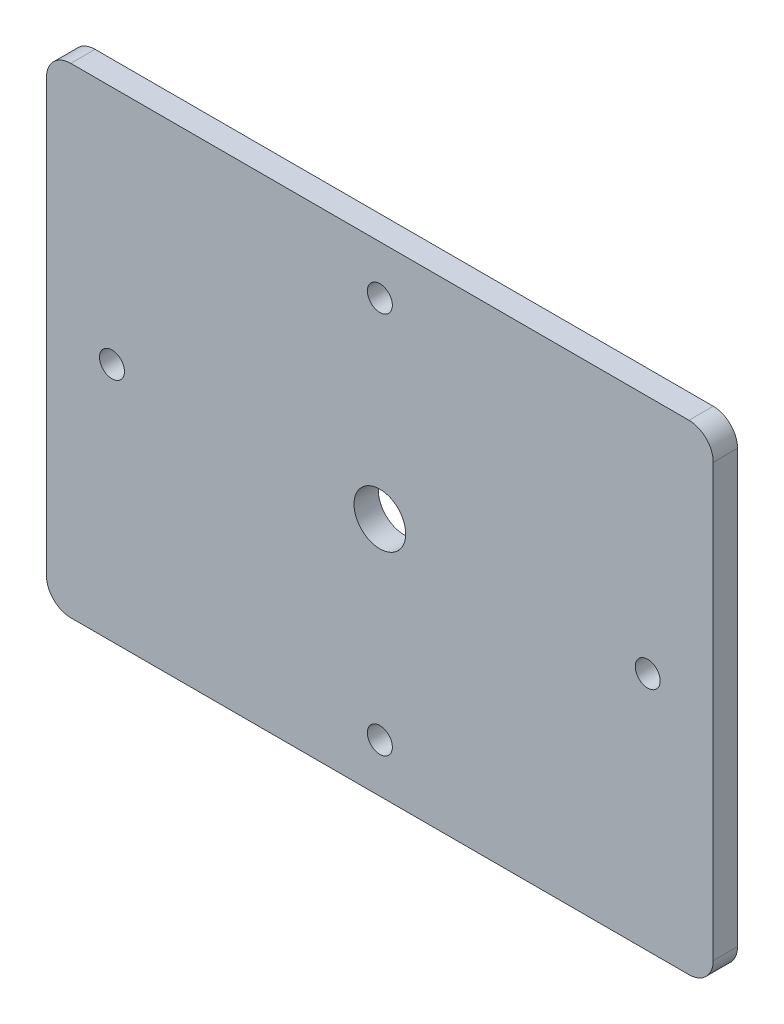
ISO-10303-21;
HEADER;
FILE_DESCRIPTION(('STEP AP214'),'2;1');
FILE_NAME('part.step','',(''),(''),'','','');
FILE_SCHEMA(('AUTOMOTIVE_DESIGN { 1 0 10303 214 1 1 1 1 }'));
ENDSEC;
DATA;
#1=APPLICATION_CONTEXT('core data for automotive mechanical design processes');
#2=APPLICATION_PROTOCOL_DEFINITION('international standard','automotive_design',2000,#1);
#3=PRODUCT_CONTEXT('',#1,'mechanical');
#4=PRODUCT('Part','Part','',(#3));
#5=PRODUCT_RELATED_PRODUCT_CATEGORY('part','',(#4));
#6=PRODUCT_DEFINITION_FORMATION('','',#4);
#7=PRODUCT_DEFINITION_CONTEXT('part definition',#1,'design');
#8=PRODUCT_DEFINITION('design','',#6,#7);
#9=PRODUCT_DEFINITION_SHAPE('','',#8);
#10=(LENGTH_UNIT() NAMED_UNIT(*) SI_UNIT(.MILLI.,.METRE.));
#11=(NAMED_UNIT(*) PLANE_ANGLE_UNIT() SI_UNIT($,.RADIAN.));
#12=(NAMED_UNIT(*) SI_UNIT($,.STERADIAN.) SOLID_ANGLE_UNIT());
#13=UNCERTAINTY_MEASURE_WITH_UNIT(LENGTH_MEASURE(1.E-05),#10,'distance_accuracy_value','');
#14=(GEOMETRIC_REPRESENTATION_CONTEXT(3) GLOBAL_UNCERTAINTY_ASSIGNED_CONTEXT((#13)) GLOBAL_UNIT_ASSIGNED_CONTEXT((#10,
#11,#12)) REPRESENTATION_CONTEXT('',''));
#15=CARTESIAN_POINT('',(0.,0.,0.));
#16=DIRECTION('',(0.,0.,1.));
#17=DIRECTION('',(1.,0.,0.));
#18=AXIS2_PLACEMENT_3D('',#15,#16,#17);
#19=CARTESIAN_POINT('',(0.,0.,0.));
#20=DIRECTION('',(0.,0.,-1.));
#21=DIRECTION('',(-1.,0.,0.));
#22=AXIS2_PLACEMENT_3D('',#19,#20,#21);
#23=PLANE('',#22);
#24=CARTESIAN_POINT('',(43.561,31.369,0.));
#25=DIRECTION('',(0.,0.,1.));
#26=DIRECTION('',(1.,0.,0.));
#27=AXIS2_PLACEMENT_3D('',#24,#25,#26);
#28=CIRCLE('',#27,3.3782);
#29=CARTESIAN_POINT('',(46.9392,31.369,0.));
#30=VERTEX_POINT('',#29);
#31=EDGE_CURVE('E225',#30,#30,#28,.T.);
#32=ORIENTED_EDGE('',*,*,#31,.T.);
#33=EDGE_LOOP('',(#32));
#34=FACE_BOUND('',#33,.T.);
#35=CARTESIAN_POINT('',(78.561,31.369,0.));
#36=DIRECTION('',(0.,0.,1.));
#37=DIRECTION('',(1.,0.,0.));
#38=AXIS2_PLACEMENT_3D('',#35,#36,#37);
#39=CIRCLE('',#38,1.63194999999999);
#40=CARTESIAN_POINT('',(80.19295,31.369,0.));
#41=VERTEX_POINT('',#40);
#42=EDGE_CURVE('E217',#41,#41,#39,.T.);
#43=ORIENTED_EDGE('',*,*,#42,.T.);
#44=EDGE_LOOP('',(#43));
#45=FACE_BOUND('',#44,.T.);
#46=DIRECTION('',(0.,-1.,0.));
#47=VECTOR('',#46,1.);
#48=CARTESIAN_POINT('',(0.,0.,0.));
#49=LINE('',#48,#47);
#50=CARTESIAN_POINT('',(0.,59.563,0.));
#51=VERTEX_POINT('',#50);
#52=CARTESIAN_POINT('',(0.,3.175,0.));
#53=VERTEX_POINT('',#52);
#54=EDGE_CURVE('E124',#51,#53,#49,.T.);
#55=ORIENTED_EDGE('',*,*,#54,.F.);
#56=CARTESIAN_POINT('',(3.175,59.563,0.));
#57=DIRECTION('',(0.,0.,-1.));
#58=DIRECTION('',(-1.,0.,0.));
#59=AXIS2_PLACEMENT_3D('',#56,#57,#58);
#60=CIRCLE('',#59,3.175);
#61=CARTESIAN_POINT('',(3.175,62.738,0.));
#62=VERTEX_POINT('',#61);
#63=EDGE_CURVE('E106',#51,#62,#60,.T.);
#64=ORIENTED_EDGE('',*,*,#63,.T.);
#65=DIRECTION('',(-1.,0.,0.));
#66=VECTOR('',#65,1.);
#67=CARTESIAN_POINT('',(0.,62.738,0.));
#68=LINE('',#67,#66);
#69=CARTESIAN_POINT('',(83.947,62.738,0.));
#70=VERTEX_POINT('',#69);
#71=EDGE_CURVE('E152',#70,#62,#68,.T.);
#72=ORIENTED_EDGE('',*,*,#71,.F.);
#73=CARTESIAN_POINT('',(83.947,59.563,0.));
#74=DIRECTION('',(0.,0.,-1.));
#75=DIRECTION('',(-1.,0.,0.));
#76=AXIS2_PLACEMENT_3D('',#73,#74,#75);
#77=CIRCLE('',#76,3.175);
#78=CARTESIAN_POINT('',(87.122,59.563,0.));
#79=VERTEX_POINT('',#78);
#80=EDGE_CURVE('E129',#70,#79,#77,.T.);
#81=ORIENTED_EDGE('',*,*,#80,.T.);
#82=DIRECTION('',(0.,1.,0.));
#83=VECTOR('',#82,1.);
#84=CARTESIAN_POINT('',(87.122,0.,0.));
#85=LINE('',#84,#83);
#86=CARTESIAN_POINT('',(87.122,3.175,0.));
#87=VERTEX_POINT('',#86);
#88=EDGE_CURVE('E141',#87,#79,#85,.T.);
#89=ORIENTED_EDGE('',*,*,#88,.F.);
#90=CARTESIAN_POINT('',(83.947,3.175,0.));
#91=DIRECTION('',(0.,0.,-1.));
#92=DIRECTION('',(-1.,0.,0.));
#93=AXIS2_PLACEMENT_3D('',#90,#91,#92);
#94=CIRCLE('',#93,3.175);
#95=CARTESIAN_POINT('',(83.947,0.,0.));
#96=VERTEX_POINT('',#95);
#97=EDGE_CURVE('E159',#87,#96,#94,.T.);
#98=ORIENTED_EDGE('',*,*,#97,.T.);
#99=DIRECTION('',(1.,0.,0.));
#100=VECTOR('',#99,1.);
#101=CARTESIAN_POINT('',(0.,0.,0.));
#102=LINE('',#101,#100);
#103=CARTESIAN_POINT('',(3.175,0.,0.));
#104=VERTEX_POINT('',#103);
#105=EDGE_CURVE('E135',#104,#96,#102,.T.);
#106=ORIENTED_EDGE('',*,*,#105,.F.);
#107=CARTESIAN_POINT('',(3.175,3.175,0.));
#108=DIRECTION('',(0.,0.,-1.));
#109=DIRECTION('',(-1.,0.,0.));
#110=AXIS2_PLACEMENT_3D('',#107,#108,#109);
#111=CIRCLE('',#110,3.175);
#112=EDGE_CURVE('E118',#104,#53,#111,.T.);
#113=ORIENTED_EDGE('',*,*,#112,.T.);
#114=EDGE_LOOP('',(#55,#64,#72,#81,#89,#98,#106,#113));
#115=FACE_BOUND('',#114,.T.);
#116=CARTESIAN_POINT('',(43.561,6.369,0.));
#117=DIRECTION('',(0.,0.,1.));
#118=DIRECTION('',(1.,0.,0.));
#119=AXIS2_PLACEMENT_3D('',#116,#117,#118);
#120=CIRCLE('',#119,1.63195);
#121=CARTESIAN_POINT('',(45.19295,6.369,0.));
#122=VERTEX_POINT('',#121);
#123=EDGE_CURVE('E136',#122,#122,#120,.T.);
#124=ORIENTED_EDGE('',*,*,#123,.T.);
#125=EDGE_LOOP('',(#124));
#126=FACE_BOUND('',#125,.T.);
#127=CARTESIAN_POINT('',(43.561,56.369,0.));
#128=DIRECTION('',(0.,0.,1.));
#129=DIRECTION('',(1.,0.,0.));
#130=AXIS2_PLACEMENT_3D('',#127,#128,#129);
#131=CIRCLE('',#130,1.63195);
#132=CARTESIAN_POINT('',(45.19295,56.369,0.));
#133=VERTEX_POINT('',#132);
#134=EDGE_CURVE('E201',#133,#133,#131,.T.);
#135=ORIENTED_EDGE('',*,*,#134,.T.);
#136=EDGE_LOOP('',(#135));
#137=FACE_BOUND('',#136,.T.);
#138=CARTESIAN_POINT('',(8.56100000000001,31.369,0.));
#139=DIRECTION('',(0.,0.,1.));
#140=DIRECTION('',(1.,0.,0.));
#141=AXIS2_PLACEMENT_3D('',#138,#139,#140);
#142=CIRCLE('',#141,1.63195);
#143=CARTESIAN_POINT('',(10.19295,31.369,0.));
#144=VERTEX_POINT('',#143);
#145=EDGE_CURVE('E209',#144,#144,#142,.T.);
#146=ORIENTED_EDGE('',*,*,#145,.T.);
#147=EDGE_LOOP('',(#146));
#148=FACE_BOUND('',#147,.T.);
#149=ADVANCED_FACE('F39',(#34,#45,#115,#126,#137,#148),#23,.T.);
#150=CARTESIAN_POINT('',(0.,0.,3.175));
#151=DIRECTION('',(1.,0.,0.));
#152=DIRECTION('',(0.,0.,-1.));
#153=AXIS2_PLACEMENT_3D('',#150,#151,#152);
#154=PLANE('',#153);
#155=DIRECTION('',(0.,-1.,0.));
#156=VECTOR('',#155,1.);
#157=CARTESIAN_POINT('',(0.,0.,3.175));
#158=LINE('',#157,#156);
#159=CARTESIAN_POINT('',(0.,59.563,3.175));
#160=VERTEX_POINT('',#159);
#161=CARTESIAN_POINT('',(0.,3.175,3.175));
#162=VERTEX_POINT('',#161);
#163=EDGE_CURVE('E127',#160,#162,#158,.T.);
#164=ORIENTED_EDGE('',*,*,#163,.F.);
#165=DIRECTION('',(0.,0.,-1.));
#166=VECTOR('',#165,1.);
#167=CARTESIAN_POINT('',(0.,59.563,3.175));
#168=LINE('',#167,#166);
#169=EDGE_CURVE('E110',#160,#51,#168,.T.);
#170=ORIENTED_EDGE('',*,*,#169,.T.);
#171=ORIENTED_EDGE('',*,*,#54,.T.);
#172=DIRECTION('',(0.,0.,-1.));
#173=VECTOR('',#172,1.);
#174=CARTESIAN_POINT('',(0.,3.175,3.175));
#175=LINE('',#174,#173);
#176=EDGE_CURVE('E130',#53,#162,#175,.F.);
#177=ORIENTED_EDGE('',*,*,#176,.T.);
#178=EDGE_LOOP('',(#164,#170,#171,#177));
#179=FACE_BOUND('',#178,.T.);
#180=ADVANCED_FACE('F123',(#179),#154,.F.);
#181=CARTESIAN_POINT('',(0.,0.,3.175));
#182=DIRECTION('',(0.,1.,0.));
#183=DIRECTION('',(0.,0.,1.));
#184=AXIS2_PLACEMENT_3D('',#181,#182,#183);
#185=PLANE('',#184);
#186=DIRECTION('',(1.,0.,0.));
#187=VECTOR('',#186,1.);
#188=CARTESIAN_POINT('',(0.,0.,3.175));
#189=LINE('',#188,#187);
#190=CARTESIAN_POINT('',(3.175,0.,3.175));
#191=VERTEX_POINT('',#190);
#192=CARTESIAN_POINT('',(83.947,0.,3.175));
#193=VERTEX_POINT('',#192);
#194=EDGE_CURVE('E192',#191,#193,#189,.T.);
#195=ORIENTED_EDGE('',*,*,#194,.F.);
#196=DIRECTION('',(0.,0.,-1.));
#197=VECTOR('',#196,1.);
#198=CARTESIAN_POINT('',(3.175,0.,3.175));
#199=LINE('',#198,#197);
#200=EDGE_CURVE('E183',#191,#104,#199,.T.);
#201=ORIENTED_EDGE('',*,*,#200,.T.);
#202=ORIENTED_EDGE('',*,*,#105,.T.);
#203=DIRECTION('',(0.,0.,-1.));
#204=VECTOR('',#203,1.);
#205=CARTESIAN_POINT('',(83.947,0.,3.175));
#206=LINE('',#205,#204);
#207=EDGE_CURVE('E180',#96,#193,#206,.F.);
#208=ORIENTED_EDGE('',*,*,#207,.T.);
#209=EDGE_LOOP('',(#195,#201,#202,#208));
#210=FACE_BOUND('',#209,.T.);
#211=ADVANCED_FACE('F262',(#210),#185,.F.);
#212=CARTESIAN_POINT('',(87.122,0.,3.175));
#213=DIRECTION('',(-1.,0.,0.));
#214=DIRECTION('',(0.,0.,1.));
#215=AXIS2_PLACEMENT_3D('',#212,#213,#214);
#216=PLANE('',#215);
#217=DIRECTION('',(0.,1.,0.));
#218=VECTOR('',#217,1.);
#219=CARTESIAN_POINT('',(87.122,0.,3.175));
#220=LINE('',#219,#218);
#221=CARTESIAN_POINT('',(87.122,3.175,3.175));
#222=VERTEX_POINT('',#221);
#223=CARTESIAN_POINT('',(87.122,59.563,3.175));
#224=VERTEX_POINT('',#223);
#225=EDGE_CURVE('E190',#222,#224,#220,.T.);
#226=ORIENTED_EDGE('',*,*,#225,.F.);
#227=DIRECTION('',(0.,0.,-1.));
#228=VECTOR('',#227,1.);
#229=CARTESIAN_POINT('',(87.122,3.175,3.175));
#230=LINE('',#229,#228);
#231=EDGE_CURVE('E11',#222,#87,#230,.T.);
#232=ORIENTED_EDGE('',*,*,#231,.T.);
#233=ORIENTED_EDGE('',*,*,#88,.T.);
#234=DIRECTION('',(0.,0.,-1.));
#235=VECTOR('',#234,1.);
#236=CARTESIAN_POINT('',(87.122,59.563,3.175));
#237=LINE('',#236,#235);
#238=EDGE_CURVE('E48',#79,#224,#237,.F.);
#239=ORIENTED_EDGE('',*,*,#238,.T.);
#240=EDGE_LOOP('',(#226,#232,#233,#239));
#241=FACE_BOUND('',#240,.T.);
#242=ADVANCED_FACE('F255',(#241),#216,.F.);
#243=CARTESIAN_POINT('',(0.,62.738,3.175));
#244=DIRECTION('',(0.,-1.,0.));
#245=DIRECTION('',(0.,0.,-1.));
#246=AXIS2_PLACEMENT_3D('',#243,#244,#245);
#247=PLANE('',#246);
#248=ORIENTED_EDGE('',*,*,#71,.T.);
#249=DIRECTION('',(0.,0.,-1.));
#250=VECTOR('',#249,1.);
#251=CARTESIAN_POINT('',(3.175,62.738,3.175));
#252=LINE('',#251,#250);
#253=CARTESIAN_POINT('',(3.175,62.738,3.175));
#254=VERTEX_POINT('',#253);
#255=EDGE_CURVE('E111',#62,#254,#252,.F.);
#256=ORIENTED_EDGE('',*,*,#255,.T.);
#257=DIRECTION('',(-1.,0.,0.));
#258=VECTOR('',#257,1.);
#259=CARTESIAN_POINT('',(0.,62.738,3.175));
#260=LINE('',#259,#258);
#261=CARTESIAN_POINT('',(83.947,62.738,3.175));
#262=VERTEX_POINT('',#261);
#263=EDGE_CURVE('E147',#262,#254,#260,.T.);
#264=ORIENTED_EDGE('',*,*,#263,.F.);
#265=DIRECTION('',(0.,0.,-1.));
#266=VECTOR('',#265,1.);
#267=CARTESIAN_POINT('',(83.947,62.738,3.175));
#268=LINE('',#267,#266);
#269=EDGE_CURVE('E117',#262,#70,#268,.T.);
#270=ORIENTED_EDGE('',*,*,#269,.T.);
#271=EDGE_LOOP('',(#248,#256,#264,#270));
#272=FACE_BOUND('',#271,.T.);
#273=ADVANCED_FACE('F240',(#272),#247,.F.);
#274=CARTESIAN_POINT('',(0.,0.,3.175));
#275=DIRECTION('',(0.,0.,-1.));
#276=DIRECTION('',(-1.,0.,0.));
#277=AXIS2_PLACEMENT_3D('',#274,#275,#276);
#278=PLANE('',#277);
#279=CARTESIAN_POINT('',(43.561,31.369,3.175));
#280=DIRECTION('',(0.,0.,1.));
#281=DIRECTION('',(1.,0.,0.));
#282=AXIS2_PLACEMENT_3D('',#279,#280,#281);
#283=CIRCLE('',#282,3.3782);
#284=CARTESIAN_POINT('',(46.9392,31.369,3.175));
#285=VERTEX_POINT('',#284);
#286=EDGE_CURVE('E229',#285,#285,#283,.T.);
#287=ORIENTED_EDGE('',*,*,#286,.F.);
#288=EDGE_LOOP('',(#287));
#289=FACE_BOUND('',#288,.T.);
#290=CARTESIAN_POINT('',(78.561,31.369,3.175));
#291=DIRECTION('',(0.,0.,1.));
#292=DIRECTION('',(1.,0.,0.));
#293=AXIS2_PLACEMENT_3D('',#290,#291,#292);
#294=CIRCLE('',#293,1.63194999999999);
#295=CARTESIAN_POINT('',(80.19295,31.369,3.175));
#296=VERTEX_POINT('',#295);
#297=EDGE_CURVE('E221',#296,#296,#294,.T.);
#298=ORIENTED_EDGE('',*,*,#297,.F.);
#299=EDGE_LOOP('',(#298));
#300=FACE_BOUND('',#299,.T.);
#301=CARTESIAN_POINT('',(8.56100000000001,31.369,3.175));
#302=DIRECTION('',(0.,0.,1.));
#303=DIRECTION('',(1.,0.,0.));
#304=AXIS2_PLACEMENT_3D('',#301,#302,#303);
#305=CIRCLE('',#304,1.63195);
#306=CARTESIAN_POINT('',(10.19295,31.369,3.175));
#307=VERTEX_POINT('',#306);
#308=EDGE_CURVE('E213',#307,#307,#305,.T.);
#309=ORIENTED_EDGE('',*,*,#308,.F.);
#310=EDGE_LOOP('',(#309));
#311=FACE_BOUND('',#310,.T.);
#312=CARTESIAN_POINT('',(43.561,56.369,3.175));
#313=DIRECTION('',(0.,0.,1.));
#314=DIRECTION('',(1.,0.,0.));
#315=AXIS2_PLACEMENT_3D('',#312,#313,#314);
#316=CIRCLE('',#315,1.63195);
#317=CARTESIAN_POINT('',(45.19295,56.369,3.175));
#318=VERTEX_POINT('',#317);
#319=EDGE_CURVE('E205',#318,#318,#316,.T.);
#320=ORIENTED_EDGE('',*,*,#319,.F.);
#321=EDGE_LOOP('',(#320));
#322=FACE_BOUND('',#321,.T.);
#323=CARTESIAN_POINT('',(43.561,6.369,3.175));
#324=DIRECTION('',(0.,0.,1.));
#325=DIRECTION('',(1.,0.,0.));
#326=AXIS2_PLACEMENT_3D('',#323,#324,#325);
#327=CIRCLE('',#326,1.63195);
#328=CARTESIAN_POINT('',(45.19295,6.369,3.175));
#329=VERTEX_POINT('',#328);
#330=EDGE_CURVE('E144',#329,#329,#327,.T.);
#331=ORIENTED_EDGE('',*,*,#330,.F.);
#332=EDGE_LOOP('',(#331));
#333=FACE_BOUND('',#332,.T.);
#334=ORIENTED_EDGE('',*,*,#263,.T.);
#335=CARTESIAN_POINT('',(3.175,59.563,3.175));
#336=DIRECTION('',(0.,0.,-1.));
#337=DIRECTION('',(-1.,0.,0.));
#338=AXIS2_PLACEMENT_3D('',#335,#336,#337);
#339=CIRCLE('',#338,3.175);
#340=EDGE_CURVE('E177',#254,#160,#339,.F.);
#341=ORIENTED_EDGE('',*,*,#340,.T.);
#342=ORIENTED_EDGE('',*,*,#163,.T.);
#343=CARTESIAN_POINT('',(3.175,3.175,3.175));
#344=DIRECTION('',(0.,0.,-1.));
#345=DIRECTION('',(-1.,0.,0.));
#346=AXIS2_PLACEMENT_3D('',#343,#344,#345);
#347=CIRCLE('',#346,3.175);
#348=EDGE_CURVE('E174',#162,#191,#347,.F.);
#349=ORIENTED_EDGE('',*,*,#348,.T.);
#350=ORIENTED_EDGE('',*,*,#194,.T.);
#351=CARTESIAN_POINT('',(83.947,3.175,3.175));
#352=DIRECTION('',(0.,0.,-1.));
#353=DIRECTION('',(-1.,0.,0.));
#354=AXIS2_PLACEMENT_3D('',#351,#352,#353);
#355=CIRCLE('',#354,3.175);
#356=EDGE_CURVE('E61',#193,#222,#355,.F.);
#357=ORIENTED_EDGE('',*,*,#356,.T.);
#358=ORIENTED_EDGE('',*,*,#225,.T.);
#359=CARTESIAN_POINT('',(83.947,59.563,3.175));
#360=DIRECTION('',(0.,0.,-1.));
#361=DIRECTION('',(-1.,0.,0.));
#362=AXIS2_PLACEMENT_3D('',#359,#360,#361);
#363=CIRCLE('',#362,3.175);
#364=EDGE_CURVE('E169',#224,#262,#363,.F.);
#365=ORIENTED_EDGE('',*,*,#364,.T.);
#366=EDGE_LOOP('',(#334,#341,#342,#349,#350,#357,#358,#365));
#367=FACE_BOUND('',#366,.T.);
#368=ADVANCED_FACE('F236',(#289,#300,#311,#322,#333,#367),#278,.F.);
#369=CARTESIAN_POINT('',(43.561,6.369,3.175));
#370=DIRECTION('',(0.,0.,1.));
#371=DIRECTION('',(1.,0.,0.));
#372=AXIS2_PLACEMENT_3D('',#369,#370,#371);
#373=CYLINDRICAL_SURFACE('',#372,1.63195);
#374=ORIENTED_EDGE('',*,*,#123,.F.);
#375=EDGE_LOOP('',(#374));
#376=FACE_BOUND('',#375,.T.);
#377=ORIENTED_EDGE('',*,*,#330,.T.);
#378=EDGE_LOOP('',(#377));
#379=FACE_BOUND('',#378,.T.);
#380=ADVANCED_FACE('F239',(#376,#379),#373,.F.);
#381=CARTESIAN_POINT('',(43.561,56.369,3.175));
#382=DIRECTION('',(0.,0.,1.));
#383=DIRECTION('',(1.,0.,0.));
#384=AXIS2_PLACEMENT_3D('',#381,#382,#383);
#385=CYLINDRICAL_SURFACE('',#384,1.63195);
#386=ORIENTED_EDGE('',*,*,#134,.F.);
#387=EDGE_LOOP('',(#386));
#388=FACE_BOUND('',#387,.T.);
#389=ORIENTED_EDGE('',*,*,#319,.T.);
#390=EDGE_LOOP('',(#389));
#391=FACE_BOUND('',#390,.T.);
#392=ADVANCED_FACE('F311',(#388,#391),#385,.F.);
#393=CARTESIAN_POINT('',(8.56100000000001,31.369,3.175));
#394=DIRECTION('',(0.,0.,1.));
#395=DIRECTION('',(1.,0.,0.));
#396=AXIS2_PLACEMENT_3D('',#393,#394,#395);
#397=CYLINDRICAL_SURFACE('',#396,1.63195);
#398=ORIENTED_EDGE('',*,*,#145,.F.);
#399=EDGE_LOOP('',(#398));
#400=FACE_BOUND('',#399,.T.);
#401=ORIENTED_EDGE('',*,*,#308,.T.);
#402=EDGE_LOOP('',(#401));
#403=FACE_BOUND('',#402,.T.);
#404=ADVANCED_FACE('F318',(#400,#403),#397,.F.);
#405=CARTESIAN_POINT('',(78.561,31.369,3.175));
#406=DIRECTION('',(0.,0.,1.));
#407=DIRECTION('',(1.,0.,0.));
#408=AXIS2_PLACEMENT_3D('',#405,#406,#407);
#409=CYLINDRICAL_SURFACE('',#408,1.63194999999999);
#410=ORIENTED_EDGE('',*,*,#42,.F.);
#411=EDGE_LOOP('',(#410));
#412=FACE_BOUND('',#411,.T.);
#413=ORIENTED_EDGE('',*,*,#297,.T.);
#414=EDGE_LOOP('',(#413));
#415=FACE_BOUND('',#414,.T.);
#416=ADVANCED_FACE('F326',(#412,#415),#409,.F.);
#417=CARTESIAN_POINT('',(43.561,31.369,3.175));
#418=DIRECTION('',(0.,0.,1.));
#419=DIRECTION('',(1.,0.,0.));
#420=AXIS2_PLACEMENT_3D('',#417,#418,#419);
#421=CYLINDRICAL_SURFACE('',#420,3.3782);
#422=ORIENTED_EDGE('',*,*,#31,.F.);
#423=EDGE_LOOP('',(#422));
#424=FACE_BOUND('',#423,.T.);
#425=ORIENTED_EDGE('',*,*,#286,.T.);
#426=EDGE_LOOP('',(#425));
#427=FACE_BOUND('',#426,.T.);
#428=ADVANCED_FACE('F234',(#424,#427),#421,.F.);
#429=CARTESIAN_POINT('',(3.175,59.563,3.175));
#430=DIRECTION('',(0.,0.,-1.));
#431=DIRECTION('',(-1.,0.,0.));
#432=AXIS2_PLACEMENT_3D('',#429,#430,#431);
#433=CYLINDRICAL_SURFACE('',#432,3.175);
#434=ORIENTED_EDGE('',*,*,#340,.F.);
#435=ORIENTED_EDGE('',*,*,#255,.F.);
#436=ORIENTED_EDGE('',*,*,#63,.F.);
#437=ORIENTED_EDGE('',*,*,#169,.F.);
#438=EDGE_LOOP('',(#434,#435,#436,#437));
#439=FACE_BOUND('',#438,.T.);
#440=ADVANCED_FACE('F109',(#439),#433,.T.);
#441=CARTESIAN_POINT('',(3.175,3.175,3.175));
#442=DIRECTION('',(0.,0.,-1.));
#443=DIRECTION('',(-1.,0.,0.));
#444=AXIS2_PLACEMENT_3D('',#441,#442,#443);
#445=CYLINDRICAL_SURFACE('',#444,3.175);
#446=ORIENTED_EDGE('',*,*,#348,.F.);
#447=ORIENTED_EDGE('',*,*,#176,.F.);
#448=ORIENTED_EDGE('',*,*,#112,.F.);
#449=ORIENTED_EDGE('',*,*,#200,.F.);
#450=EDGE_LOOP('',(#446,#447,#448,#449));
#451=FACE_BOUND('',#450,.T.);
#452=ADVANCED_FACE('F265',(#451),#445,.T.);
#453=CARTESIAN_POINT('',(83.947,3.175,3.175));
#454=DIRECTION('',(0.,0.,-1.));
#455=DIRECTION('',(-1.,0.,0.));
#456=AXIS2_PLACEMENT_3D('',#453,#454,#455);
#457=CYLINDRICAL_SURFACE('',#456,3.175);
#458=ORIENTED_EDGE('',*,*,#356,.F.);
#459=ORIENTED_EDGE('',*,*,#207,.F.);
#460=ORIENTED_EDGE('',*,*,#97,.F.);
#461=ORIENTED_EDGE('',*,*,#231,.F.);
#462=EDGE_LOOP('',(#458,#459,#460,#461));
#463=FACE_BOUND('',#462,.T.);
#464=ADVANCED_FACE('F258',(#463),#457,.T.);
#465=CARTESIAN_POINT('',(83.947,59.563,3.175));
#466=DIRECTION('',(0.,0.,-1.));
#467=DIRECTION('',(-1.,0.,0.));
#468=AXIS2_PLACEMENT_3D('',#465,#466,#467);
#469=CYLINDRICAL_SURFACE('',#468,3.175);
#470=ORIENTED_EDGE('',*,*,#364,.F.);
#471=ORIENTED_EDGE('',*,*,#238,.F.);
#472=ORIENTED_EDGE('',*,*,#80,.F.);
#473=ORIENTED_EDGE('',*,*,#269,.F.);
#474=EDGE_LOOP('',(#470,#471,#472,#473));
#475=FACE_BOUND('',#474,.T.);
#476=ADVANCED_FACE('F41',(#475),#469,.T.);
#477=CLOSED_SHELL('',(#149,#180,#211,#242,#273,#368,#380,#392,#404,#416,#428,#440,#452,#464,#476));
#478=MANIFOLD_SOLID_BREP('B2',#477);
#479=ADVANCED_BREP_SHAPE_REPRESENTATION('',(#18,#478),#14);
#480=SHAPE_DEFINITION_REPRESENTATION(#9,#479);
ENDSEC;
END-ISO-10303-21;
